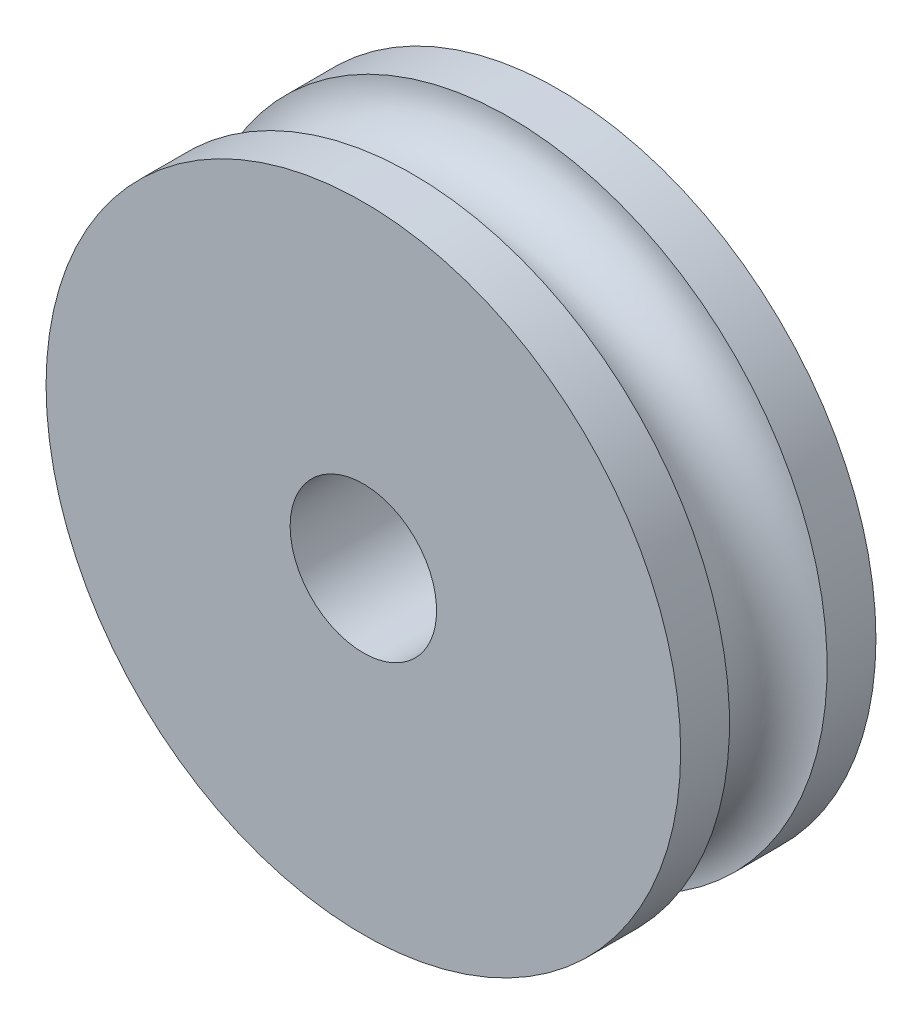
ISO-10303-21;
HEADER;
FILE_DESCRIPTION(('STEP AP214'),'2;1');
FILE_NAME('part.step','',(''),(''),'','','');
FILE_SCHEMA(('AUTOMOTIVE_DESIGN { 1 0 10303 214 1 1 1 1 }'));
ENDSEC;
DATA;
#1=APPLICATION_CONTEXT('core data for automotive mechanical design processes');
#2=APPLICATION_PROTOCOL_DEFINITION('international standard','automotive_design',2000,#1);
#3=PRODUCT_CONTEXT('',#1,'mechanical');
#4=PRODUCT('Part','Part','',(#3));
#5=PRODUCT_RELATED_PRODUCT_CATEGORY('part','',(#4));
#6=PRODUCT_DEFINITION_FORMATION('','',#4);
#7=PRODUCT_DEFINITION_CONTEXT('part definition',#1,'design');
#8=PRODUCT_DEFINITION('design','',#6,#7);
#9=PRODUCT_DEFINITION_SHAPE('','',#8);
#10=(LENGTH_UNIT() NAMED_UNIT(*) SI_UNIT(.MILLI.,.METRE.));
#11=(NAMED_UNIT(*) PLANE_ANGLE_UNIT() SI_UNIT($,.RADIAN.));
#12=(NAMED_UNIT(*) SI_UNIT($,.STERADIAN.) SOLID_ANGLE_UNIT());
#13=UNCERTAINTY_MEASURE_WITH_UNIT(LENGTH_MEASURE(1.E-05),#10,'distance_accuracy_value','');
#14=(GEOMETRIC_REPRESENTATION_CONTEXT(3) GLOBAL_UNCERTAINTY_ASSIGNED_CONTEXT((#13)) GLOBAL_UNIT_ASSIGNED_CONTEXT((#10,
#11,#12)) REPRESENTATION_CONTEXT('',''));
#15=CARTESIAN_POINT('',(0.,0.,0.));
#16=DIRECTION('',(0.,0.,1.));
#17=DIRECTION('',(1.,0.,0.));
#18=AXIS2_PLACEMENT_3D('',#15,#16,#17);
#19=CARTESIAN_POINT('',(0.,0.,4.));
#20=DIRECTION('',(0.,0.,-1.));
#21=DIRECTION('',(-1.,0.,0.));
#22=AXIS2_PLACEMENT_3D('',#19,#20,#21);
#23=CYLINDRICAL_SURFACE('',#22,6.5);
#24=CARTESIAN_POINT('',(0.,0.,0.));
#25=DIRECTION('',(0.,0.,1.));
#26=DIRECTION('',(1.,0.,0.));
#27=AXIS2_PLACEMENT_3D('',#24,#25,#26);
#28=CIRCLE('',#27,6.5);
#29=CARTESIAN_POINT('',(6.5,0.,0.));
#30=VERTEX_POINT('',#29);
#31=EDGE_CURVE('E42',#30,#30,#28,.T.);
#32=ORIENTED_EDGE('',*,*,#31,.T.);
#33=EDGE_LOOP('',(#32));
#34=FACE_BOUND('',#33,.T.);
#35=CARTESIAN_POINT('',(0.,0.,0.999999999999999));
#36=DIRECTION('',(0.,0.,-1.));
#37=DIRECTION('',(-1.,0.,0.));
#38=AXIS2_PLACEMENT_3D('',#35,#36,#37);
#39=CIRCLE('',#38,6.5);
#40=CARTESIAN_POINT('',(-6.5,0.,0.999999999999999));
#41=VERTEX_POINT('',#40);
#42=EDGE_CURVE('E53',#41,#41,#39,.T.);
#43=ORIENTED_EDGE('',*,*,#42,.T.);
#44=EDGE_LOOP('',(#43));
#45=FACE_BOUND('',#44,.T.);
#46=ADVANCED_FACE('F39',(#34,#45),#23,.T.);
#47=CARTESIAN_POINT('',(0.,0.,0.));
#48=DIRECTION('',(0.,0.,1.));
#49=DIRECTION('',(1.,0.,0.));
#50=AXIS2_PLACEMENT_3D('',#47,#48,#49);
#51=PLANE('',#50);
#52=CARTESIAN_POINT('',(0.,0.,0.));
#53=DIRECTION('',(0.,0.,-1.));
#54=DIRECTION('',(-1.,0.,0.));
#55=AXIS2_PLACEMENT_3D('',#52,#53,#54);
#56=CIRCLE('',#55,1.5);
#57=CARTESIAN_POINT('',(-1.5,0.,0.));
#58=VERTEX_POINT('',#57);
#59=EDGE_CURVE('E57',#58,#58,#56,.T.);
#60=ORIENTED_EDGE('',*,*,#59,.F.);
#61=EDGE_LOOP('',(#60));
#62=FACE_BOUND('',#61,.T.);
#63=ORIENTED_EDGE('',*,*,#31,.F.);
#64=EDGE_LOOP('',(#63));
#65=FACE_BOUND('',#64,.T.);
#66=ADVANCED_FACE('F72',(#62,#65),#51,.F.);
#67=CARTESIAN_POINT('',(0.,0.,2.));
#68=DIRECTION('',(0.,0.,-1.));
#69=DIRECTION('',(-1.,0.,0.));
#70=AXIS2_PLACEMENT_3D('',#67,#68,#69);
#71=TOROIDAL_SURFACE('',#70,6.5,1.);
#72=CARTESIAN_POINT('',(0.,0.,3.));
#73=DIRECTION('',(0.,0.,-1.));
#74=DIRECTION('',(-1.,0.,0.));
#75=AXIS2_PLACEMENT_3D('',#72,#73,#74);
#76=CIRCLE('',#75,6.5);
#77=CARTESIAN_POINT('',(-6.5,0.,3.));
#78=VERTEX_POINT('',#77);
#79=EDGE_CURVE('E49',#78,#78,#76,.T.);
#80=ORIENTED_EDGE('',*,*,#79,.T.);
#81=EDGE_LOOP('',(#80));
#82=FACE_BOUND('',#81,.T.);
#83=ORIENTED_EDGE('',*,*,#42,.F.);
#84=EDGE_LOOP('',(#83));
#85=FACE_BOUND('',#84,.T.);
#86=ADVANCED_FACE('F75',(#82,#85),#71,.F.);
#87=CARTESIAN_POINT('',(0.,0.,4.));
#88=DIRECTION('',(0.,0.,1.));
#89=DIRECTION('',(1.,0.,0.));
#90=AXIS2_PLACEMENT_3D('',#87,#88,#89);
#91=PLANE('',#90);
#92=CARTESIAN_POINT('',(0.,0.,4.));
#93=DIRECTION('',(0.,0.,-1.));
#94=DIRECTION('',(-1.,0.,0.));
#95=AXIS2_PLACEMENT_3D('',#92,#93,#94);
#96=CIRCLE('',#95,1.5);
#97=CARTESIAN_POINT('',(-1.5,0.,4.));
#98=VERTEX_POINT('',#97);
#99=EDGE_CURVE('E56',#98,#98,#96,.T.);
#100=ORIENTED_EDGE('',*,*,#99,.T.);
#101=EDGE_LOOP('',(#100));
#102=FACE_BOUND('',#101,.T.);
#103=CARTESIAN_POINT('',(0.,0.,4.));
#104=DIRECTION('',(0.,0.,1.));
#105=DIRECTION('',(1.,0.,0.));
#106=AXIS2_PLACEMENT_3D('',#103,#104,#105);
#107=CIRCLE('',#106,6.5);
#108=CARTESIAN_POINT('',(6.5,0.,4.));
#109=VERTEX_POINT('',#108);
#110=EDGE_CURVE('E10',#109,#109,#107,.T.);
#111=ORIENTED_EDGE('',*,*,#110,.T.);
#112=EDGE_LOOP('',(#111));
#113=FACE_BOUND('',#112,.T.);
#114=ADVANCED_FACE('F63',(#102,#113),#91,.T.);
#115=ORIENTED_EDGE('',*,*,#110,.F.);
#116=EDGE_LOOP('',(#115));
#117=FACE_BOUND('',#116,.T.);
#118=ORIENTED_EDGE('',*,*,#79,.F.);
#119=EDGE_LOOP('',(#118));
#120=FACE_BOUND('',#119,.T.);
#121=ADVANCED_FACE('F68',(#117,#120),#23,.T.);
#122=CARTESIAN_POINT('',(0.,0.,4.));
#123=DIRECTION('',(0.,0.,-1.));
#124=DIRECTION('',(-1.,0.,0.));
#125=AXIS2_PLACEMENT_3D('',#122,#123,#124);
#126=CYLINDRICAL_SURFACE('',#125,1.5);
#127=ORIENTED_EDGE('',*,*,#99,.F.);
#128=EDGE_LOOP('',(#127));
#129=FACE_BOUND('',#128,.T.);
#130=ORIENTED_EDGE('',*,*,#59,.T.);
#131=EDGE_LOOP('',(#130));
#132=FACE_BOUND('',#131,.T.);
#133=ADVANCED_FACE('F65',(#129,#132),#126,.F.);
#134=CLOSED_SHELL('',(#46,#66,#86,#114,#121,#133));
#135=MANIFOLD_SOLID_BREP('B2',#134);
#136=ADVANCED_BREP_SHAPE_REPRESENTATION('',(#18,#135),#14);
#137=SHAPE_DEFINITION_REPRESENTATION(#9,#136);
ENDSEC;
END-ISO-10303-21;
